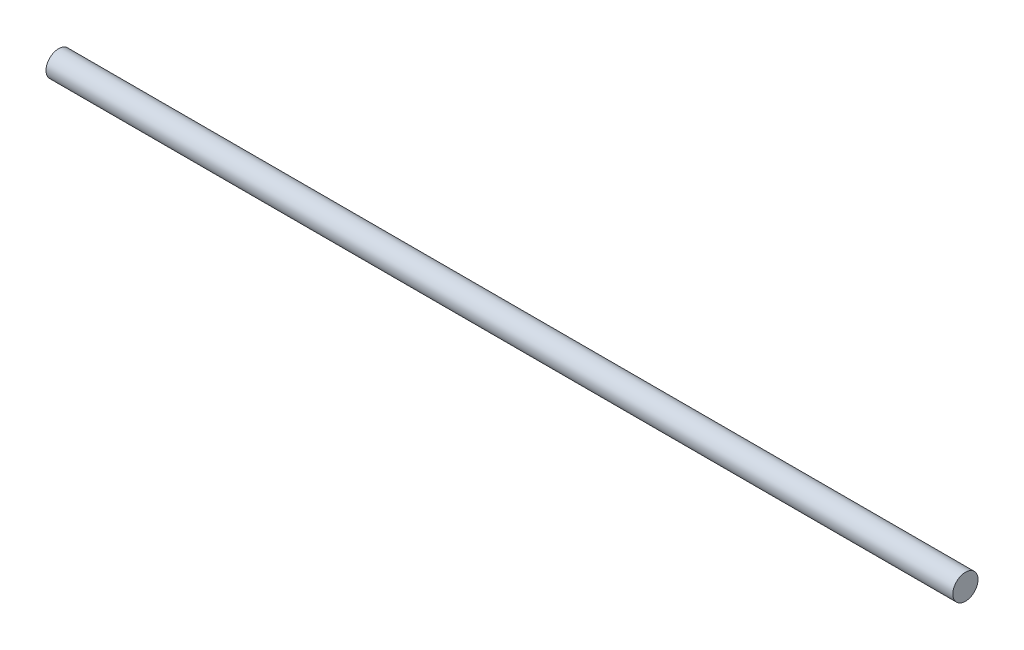
ISO-10303-21;
HEADER;
FILE_DESCRIPTION(('STEP AP214'),'2;1');
FILE_NAME('part.step','',(''),(''),'','','');
FILE_SCHEMA(('AUTOMOTIVE_DESIGN { 1 0 10303 214 1 1 1 1 }'));
ENDSEC;
DATA;
#1=APPLICATION_CONTEXT('core data for automotive mechanical design processes');
#2=APPLICATION_PROTOCOL_DEFINITION('international standard','automotive_design',2000,#1);
#3=PRODUCT_CONTEXT('',#1,'mechanical');
#4=PRODUCT('Part','Part','',(#3));
#5=PRODUCT_RELATED_PRODUCT_CATEGORY('part','',(#4));
#6=PRODUCT_DEFINITION_FORMATION('','',#4);
#7=PRODUCT_DEFINITION_CONTEXT('part definition',#1,'design');
#8=PRODUCT_DEFINITION('design','',#6,#7);
#9=PRODUCT_DEFINITION_SHAPE('','',#8);
#10=(LENGTH_UNIT() NAMED_UNIT(*) SI_UNIT(.MILLI.,.METRE.));
#11=(NAMED_UNIT(*) PLANE_ANGLE_UNIT() SI_UNIT($,.RADIAN.));
#12=(NAMED_UNIT(*) SI_UNIT($,.STERADIAN.) SOLID_ANGLE_UNIT());
#13=UNCERTAINTY_MEASURE_WITH_UNIT(LENGTH_MEASURE(1.E-05),#10,'distance_accuracy_value','');
#14=(GEOMETRIC_REPRESENTATION_CONTEXT(3) GLOBAL_UNCERTAINTY_ASSIGNED_CONTEXT((#13)) GLOBAL_UNIT_ASSIGNED_CONTEXT((#10,
#11,#12)) REPRESENTATION_CONTEXT('',''));
#15=CARTESIAN_POINT('',(0.,0.,0.));
#16=DIRECTION('',(0.,0.,1.));
#17=DIRECTION('',(1.,0.,0.));
#18=AXIS2_PLACEMENT_3D('',#15,#16,#17);
#19=CARTESIAN_POINT('',(180.,18.,0.));
#20=DIRECTION('',(-1.,0.,0.));
#21=DIRECTION('',(0.,0.,1.));
#22=AXIS2_PLACEMENT_3D('',#19,#20,#21);
#23=CYLINDRICAL_SURFACE('',#22,2.5);
#24=CARTESIAN_POINT('',(180.,18.,0.));
#25=DIRECTION('',(1.,0.,0.));
#26=DIRECTION('',(0.,0.,-1.));
#27=AXIS2_PLACEMENT_3D('',#24,#25,#26);
#28=CIRCLE('',#27,2.5);
#29=CARTESIAN_POINT('',(180.,18.,2.49999999999999));
#30=VERTEX_POINT('',#29);
#31=EDGE_CURVE('E10',#30,#30,#28,.T.);
#32=CARTESIAN_POINT('',(0.,18.,0.));
#33=DIRECTION('',(1.,0.,0.));
#34=DIRECTION('',(0.,0.,-1.));
#35=AXIS2_PLACEMENT_3D('',#32,#33,#34);
#36=CIRCLE('',#35,2.5);
#37=CARTESIAN_POINT('',(0.,18.,2.49999999999999));
#38=VERTEX_POINT('',#37);
#39=EDGE_CURVE('E39',#38,#38,#36,.T.);
#40=CARTESIAN_POINT('',(180.,18.,2.49999999999999));
#41=CARTESIAN_POINT('',(178.125,18.,2.49999999999999));
#42=CARTESIAN_POINT('',(176.25,18.,2.49999999999999));
#43=CARTESIAN_POINT('',(172.5,18.,2.49999999999999));
#44=CARTESIAN_POINT('',(170.625,18.,2.49999999999999));
#45=CARTESIAN_POINT('',(166.875,18.,2.49999999999999));
#46=CARTESIAN_POINT('',(165.,18.,2.49999999999999));
#47=CARTESIAN_POINT('',(161.25,18.,2.49999999999999));
#48=CARTESIAN_POINT('',(159.375,18.,2.49999999999999));
#49=CARTESIAN_POINT('',(155.625,18.,2.49999999999999));
#50=CARTESIAN_POINT('',(153.75,18.,2.49999999999999));
#51=CARTESIAN_POINT('',(150.,18.,2.49999999999999));
#52=CARTESIAN_POINT('',(148.125,18.,2.49999999999999));
#53=CARTESIAN_POINT('',(144.375,18.,2.49999999999999));
#54=CARTESIAN_POINT('',(142.5,18.,2.49999999999999));
#55=CARTESIAN_POINT('',(138.75,18.,2.49999999999999));
#56=CARTESIAN_POINT('',(136.875,18.,2.49999999999999));
#57=CARTESIAN_POINT('',(133.125,18.,2.49999999999999));
#58=CARTESIAN_POINT('',(131.25,18.,2.49999999999999));
#59=CARTESIAN_POINT('',(127.5,18.,2.49999999999999));
#60=CARTESIAN_POINT('',(125.625,18.,2.49999999999999));
#61=CARTESIAN_POINT('',(121.875,18.,2.49999999999999));
#62=CARTESIAN_POINT('',(120.,18.,2.49999999999999));
#63=CARTESIAN_POINT('',(116.25,18.,2.49999999999999));
#64=CARTESIAN_POINT('',(114.375,18.,2.49999999999999));
#65=CARTESIAN_POINT('',(110.625,18.,2.49999999999999));
#66=CARTESIAN_POINT('',(108.75,18.,2.49999999999999));
#67=CARTESIAN_POINT('',(105.,18.,2.49999999999999));
#68=CARTESIAN_POINT('',(103.125,18.,2.49999999999999));
#69=CARTESIAN_POINT('',(99.375,18.,2.49999999999999));
#70=CARTESIAN_POINT('',(97.5,18.,2.49999999999999));
#71=CARTESIAN_POINT('',(93.75,18.,2.49999999999999));
#72=CARTESIAN_POINT('',(91.875,18.,2.49999999999999));
#73=CARTESIAN_POINT('',(88.125,18.,2.49999999999999));
#74=CARTESIAN_POINT('',(86.25,18.,2.49999999999999));
#75=CARTESIAN_POINT('',(82.5,18.,2.49999999999999));
#76=CARTESIAN_POINT('',(80.625,18.,2.49999999999999));
#77=CARTESIAN_POINT('',(76.875,18.,2.49999999999999));
#78=CARTESIAN_POINT('',(75.,18.,2.49999999999999));
#79=CARTESIAN_POINT('',(71.25,18.,2.49999999999999));
#80=CARTESIAN_POINT('',(69.375,18.,2.49999999999999));
#81=CARTESIAN_POINT('',(65.625,18.,2.49999999999999));
#82=CARTESIAN_POINT('',(63.75,18.,2.49999999999999));
#83=CARTESIAN_POINT('',(60.,18.,2.49999999999999));
#84=CARTESIAN_POINT('',(58.125,18.,2.49999999999999));
#85=CARTESIAN_POINT('',(54.375,18.,2.49999999999999));
#86=CARTESIAN_POINT('',(52.5,18.,2.49999999999999));
#87=CARTESIAN_POINT('',(48.75,18.,2.49999999999999));
#88=CARTESIAN_POINT('',(46.875,18.,2.49999999999999));
#89=CARTESIAN_POINT('',(43.125,18.,2.49999999999999));
#90=CARTESIAN_POINT('',(41.25,18.,2.49999999999999));
#91=CARTESIAN_POINT('',(37.5,18.,2.49999999999999));
#92=CARTESIAN_POINT('',(35.625,18.,2.49999999999999));
#93=CARTESIAN_POINT('',(31.875,18.,2.49999999999999));
#94=CARTESIAN_POINT('',(30.,18.,2.49999999999999));
#95=CARTESIAN_POINT('',(26.25,18.,2.49999999999999));
#96=CARTESIAN_POINT('',(24.375,18.,2.49999999999999));
#97=CARTESIAN_POINT('',(20.625,18.,2.49999999999999));
#98=CARTESIAN_POINT('',(18.75,18.,2.49999999999999));
#99=CARTESIAN_POINT('',(15.,18.,2.49999999999999));
#100=CARTESIAN_POINT('',(13.125,18.,2.49999999999999));
#101=CARTESIAN_POINT('',(9.37499999999998,18.,2.49999999999999));
#102=CARTESIAN_POINT('',(7.49999999999997,18.,2.49999999999999));
#103=CARTESIAN_POINT('',(3.74999999999997,18.,2.49999999999999));
#104=CARTESIAN_POINT('',(1.87499999999997,18.,2.49999999999999));
#105=CARTESIAN_POINT('',(0.,18.,2.49999999999999));
#106=B_SPLINE_CURVE_WITH_KNOTS('',3,(#40,#41,#42,#43,#44,#45,#46,#47,#48,#49,#50,#51,#52,#53,
#54,#55,#56,#57,#58,#59,#60,#61,#62,#63,#64,#65,#66,#67,#68,#69,#70,#71,#72,#73,#74,#75,#76,#77,
#78,#79,#80,#81,#82,#83,#84,#85,#86,#87,#88,#89,#90,#91,#92,#93,#94,#95,#96,#97,#98,#99,#100,
#101,#102,#103,#104,#105),.UNSPECIFIED.,.F.,.F.,(4,2,2,2,2,2,2,2,2,2,2,2,2,2,2,2,2,2,2,2,2,2,2,
2,2,2,2,2,2,2,2,2,4),(0.,5.62499999999999,11.25,16.875,22.5,28.125,33.75,39.375,45.,50.625,
56.25,61.875,67.5,73.125,78.75,84.375,90.,95.625,101.25,106.875,112.5,118.125,123.75,129.375,
135.,140.625,146.25,151.875,157.5,163.125,168.75,174.375,180.),.UNSPECIFIED.);
#107=EDGE_CURVE('BSEAM36',#30,#38,#106,.T.);
#108=ORIENTED_EDGE('',*,*,#31,.F.);
#109=ORIENTED_EDGE('',*,*,#39,.T.);
#110=ORIENTED_EDGE('',*,*,#107,.T.);
#111=ORIENTED_EDGE('',*,*,#107,.F.);
#112=EDGE_LOOP('',(#108,#110,#109,#111));
#113=FACE_BOUND('',#112,.T.);
#114=ADVANCED_FACE('F36',(#113),#23,.T.);
#115=CARTESIAN_POINT('',(180.,18.,0.));
#116=DIRECTION('',(1.,0.,0.));
#117=DIRECTION('',(0.,0.,-1.));
#118=AXIS2_PLACEMENT_3D('',#115,#116,#117);
#119=PLANE('',#118);
#120=ORIENTED_EDGE('',*,*,#31,.T.);
#121=EDGE_LOOP('',(#120));
#122=FACE_BOUND('',#121,.T.);
#123=ADVANCED_FACE('F51',(#122),#119,.T.);
#124=CARTESIAN_POINT('',(0.,18.,0.));
#125=DIRECTION('',(1.,0.,0.));
#126=DIRECTION('',(0.,0.,-1.));
#127=AXIS2_PLACEMENT_3D('',#124,#125,#126);
#128=PLANE('',#127);
#129=ORIENTED_EDGE('',*,*,#39,.F.);
#130=EDGE_LOOP('',(#129));
#131=FACE_BOUND('',#130,.T.);
#132=ADVANCED_FACE('F49',(#131),#128,.F.);
#133=CLOSED_SHELL('',(#114,#123,#132));
#134=MANIFOLD_SOLID_BREP('B2',#133);
#135=ADVANCED_BREP_SHAPE_REPRESENTATION('',(#18,#134),#14);
#136=SHAPE_DEFINITION_REPRESENTATION(#9,#135);
ENDSEC;
END-ISO-10303-21;
